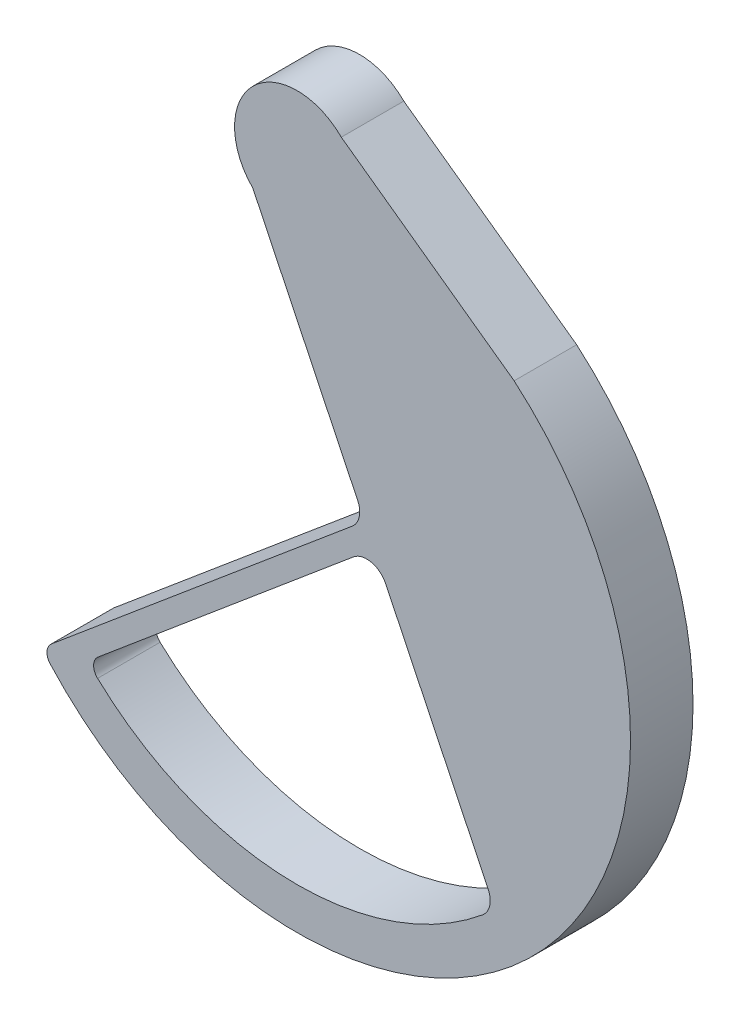
ISO-10303-21;
HEADER;
FILE_DESCRIPTION(('STEP AP214'),'2;1');
FILE_NAME('part.step','',(''),(''),'','','');
FILE_SCHEMA(('AUTOMOTIVE_DESIGN { 1 0 10303 214 1 1 1 1 }'));
ENDSEC;
DATA;
#1=APPLICATION_CONTEXT('core data for automotive mechanical design processes');
#2=APPLICATION_PROTOCOL_DEFINITION('international standard','automotive_design',2000,#1);
#3=PRODUCT_CONTEXT('',#1,'mechanical');
#4=PRODUCT('Part','Part','',(#3));
#5=PRODUCT_RELATED_PRODUCT_CATEGORY('part','',(#4));
#6=PRODUCT_DEFINITION_FORMATION('','',#4);
#7=PRODUCT_DEFINITION_CONTEXT('part definition',#1,'design');
#8=PRODUCT_DEFINITION('design','',#6,#7);
#9=PRODUCT_DEFINITION_SHAPE('','',#8);
#10=(LENGTH_UNIT() NAMED_UNIT(*) SI_UNIT(.MILLI.,.METRE.));
#11=(NAMED_UNIT(*) PLANE_ANGLE_UNIT() SI_UNIT($,.RADIAN.));
#12=(NAMED_UNIT(*) SI_UNIT($,.STERADIAN.) SOLID_ANGLE_UNIT());
#13=UNCERTAINTY_MEASURE_WITH_UNIT(LENGTH_MEASURE(1.E-05),#10,'distance_accuracy_value','');
#14=(GEOMETRIC_REPRESENTATION_CONTEXT(3) GLOBAL_UNCERTAINTY_ASSIGNED_CONTEXT((#13)) GLOBAL_UNIT_ASSIGNED_CONTEXT((#10,
#11,#12)) REPRESENTATION_CONTEXT('',''));
#15=CARTESIAN_POINT('',(0.,0.,0.));
#16=DIRECTION('',(0.,0.,1.));
#17=DIRECTION('',(1.,0.,0.));
#18=AXIS2_PLACEMENT_3D('',#15,#16,#17);
#19=CARTESIAN_POINT('',(-12.7570586950624,-6.1348621133076,15.));
#20=DIRECTION('',(0.901206602628173,0.433389731511241,0.));
#21=DIRECTION('',(-0.433389731511241,0.901206602628173,0.));
#22=AXIS2_PLACEMENT_3D('',#19,#20,#21);
#23=PLANE('',#22);
#24=DIRECTION('',(0.433389731511241,-0.901206602628173,0.));
#25=VECTOR('',#24,1.);
#26=CARTESIAN_POINT('',(-12.7570586950624,-6.1348621133076,0.));
#27=LINE('',#26,#25);
#28=CARTESIAN_POINT('',(21.2324006956412,-76.8137984043253,0.));
#29=VERTEX_POINT('',#28);
#30=CARTESIAN_POINT('',(45.844843506453,-127.9938203457,0.));
#31=VERTEX_POINT('',#30);
#32=EDGE_CURVE('E185',#29,#31,#27,.T.);
#33=ORIENTED_EDGE('',*,*,#32,.T.);
#34=DIRECTION('',(0.,0.,-1.));
#35=VECTOR('',#34,1.);
#36=CARTESIAN_POINT('',(45.844843506453,-127.9938203457,15.));
#37=LINE('',#36,#35);
#38=CARTESIAN_POINT('',(45.844843506453,-127.9938203457,15.));
#39=VERTEX_POINT('',#38);
#40=EDGE_CURVE('E11',#39,#31,#37,.T.);
#41=ORIENTED_EDGE('',*,*,#40,.F.);
#42=DIRECTION('',(0.433389731511241,-0.901206602628173,0.));
#43=VECTOR('',#42,1.);
#44=CARTESIAN_POINT('',(-12.7570586950624,-6.1348621133076,15.));
#45=LINE('',#44,#43);
#46=CARTESIAN_POINT('',(21.2324006956412,-76.8137984043253,15.));
#47=VERTEX_POINT('',#46);
#48=EDGE_CURVE('E250',#47,#39,#45,.T.);
#49=ORIENTED_EDGE('',*,*,#48,.F.);
#50=DIRECTION('',(0.,0.,-1.));
#51=VECTOR('',#50,1.);
#52=CARTESIAN_POINT('',(21.2324006956412,-76.8137984043253,15.));
#53=LINE('',#52,#51);
#54=EDGE_CURVE('E198',#47,#29,#53,.T.);
#55=ORIENTED_EDGE('',*,*,#54,.T.);
#56=EDGE_LOOP('',(#33,#41,#49,#55));
#57=FACE_BOUND('',#56,.T.);
#58=ADVANCED_FACE('F35',(#57),#23,.F.);
#59=CARTESIAN_POINT('',(41.3388104933121,-130.160769003256,15.));
#60=DIRECTION('',(0.,0.,-1.));
#61=DIRECTION('',(-1.,0.,0.));
#62=AXIS2_PLACEMENT_3D('',#59,#60,#61);
#63=CYLINDRICAL_SURFACE('',#62,4.99999999999999);
#64=CARTESIAN_POINT('',(41.3388104933121,-130.160769003256,0.));
#65=DIRECTION('',(0.,0.,1.));
#66=DIRECTION('',(1.,0.,0.));
#67=AXIS2_PLACEMENT_3D('',#64,#65,#66);
#68=CIRCLE('',#67,4.99999999999999);
#69=CARTESIAN_POINT('',(44.5187189927976,-134.019289695814,0.));
#70=VERTEX_POINT('',#69);
#71=EDGE_CURVE('E188',#31,#70,#68,.F.);
#72=ORIENTED_EDGE('',*,*,#71,.T.);
#73=DIRECTION('',(0.,0.,-1.));
#74=VECTOR('',#73,1.);
#75=CARTESIAN_POINT('',(44.5187189927976,-134.019289695814,15.));
#76=LINE('',#75,#74);
#77=CARTESIAN_POINT('',(44.5187189927976,-134.019289695814,15.));
#78=VERTEX_POINT('',#77);
#79=EDGE_CURVE('E45',#78,#70,#76,.T.);
#80=ORIENTED_EDGE('',*,*,#79,.F.);
#81=CARTESIAN_POINT('',(41.3388104933121,-130.160769003256,15.));
#82=DIRECTION('',(0.,0.,1.));
#83=DIRECTION('',(1.,0.,0.));
#84=AXIS2_PLACEMENT_3D('',#81,#82,#83);
#85=CIRCLE('',#84,4.99999999999999);
#86=EDGE_CURVE('E252',#39,#78,#85,.F.);
#87=ORIENTED_EDGE('',*,*,#86,.F.);
#88=ORIENTED_EDGE('',*,*,#40,.T.);
#89=EDGE_LOOP('',(#72,#80,#87,#88));
#90=FACE_BOUND('',#89,.T.);
#91=ADVANCED_FACE('F276',(#90),#63,.F.);
#92=CARTESIAN_POINT('',(0.,-80.,15.));
#93=DIRECTION('',(0.,0.,-1.));
#94=DIRECTION('',(-1.,0.,0.));
#95=AXIS2_PLACEMENT_3D('',#92,#93,#94);
#96=CYLINDRICAL_SURFACE('',#95,70.);
#97=CARTESIAN_POINT('',(0.,-80.,0.));
#98=DIRECTION('',(0.,0.,1.));
#99=DIRECTION('',(1.,0.,0.));
#100=AXIS2_PLACEMENT_3D('',#97,#98,#99);
#101=CIRCLE('',#100,70.);
#102=CARTESIAN_POINT('',(-47.870174388264,-131.072951785042,0.));
#103=VERTEX_POINT('',#102);
#104=EDGE_CURVE('E191',#103,#70,#101,.T.);
#105=ORIENTED_EDGE('',*,*,#104,.F.);
#106=DIRECTION('',(0.,0.,-1.));
#107=VECTOR('',#106,1.);
#108=CARTESIAN_POINT('',(-47.870174388264,-131.072951785042,15.));
#109=LINE('',#108,#107);
#110=CARTESIAN_POINT('',(-47.870174388264,-131.072951785042,15.));
#111=VERTEX_POINT('',#110);
#112=EDGE_CURVE('E155',#111,#103,#109,.T.);
#113=ORIENTED_EDGE('',*,*,#112,.F.);
#114=CARTESIAN_POINT('',(0.,-80.,15.));
#115=DIRECTION('',(0.,0.,1.));
#116=DIRECTION('',(1.,0.,0.));
#117=AXIS2_PLACEMENT_3D('',#114,#115,#116);
#118=CIRCLE('',#117,70.);
#119=EDGE_CURVE('E148',#111,#78,#118,.T.);
#120=ORIENTED_EDGE('',*,*,#119,.T.);
#121=ORIENTED_EDGE('',*,*,#79,.T.);
#122=EDGE_LOOP('',(#105,#113,#120,#121));
#123=FACE_BOUND('',#122,.T.);
#124=ADVANCED_FACE('F255',(#123),#96,.F.);
#125=CARTESIAN_POINT('',(-45.8185954859101,-128.884110994254,15.));
#126=DIRECTION('',(0.,0.,-1.));
#127=DIRECTION('',(-1.,0.,0.));
#128=AXIS2_PLACEMENT_3D('',#125,#126,#127);
#129=CYLINDRICAL_SURFACE('',#128,2.99999999999979);
#130=CARTESIAN_POINT('',(-45.8185954859101,-128.884110994254,0.));
#131=DIRECTION('',(0.,0.,1.));
#132=DIRECTION('',(1.,0.,0.));
#133=AXIS2_PLACEMENT_3D('',#130,#131,#132);
#134=CIRCLE('',#133,2.99999999999979);
#135=CARTESIAN_POINT('',(-47.7476784165524,-126.586582094174,0.));
#136=VERTEX_POINT('',#135);
#137=EDGE_CURVE('E154',#103,#136,#134,.F.);
#138=ORIENTED_EDGE('',*,*,#137,.T.);
#139=DIRECTION('',(0.,0.,-1.));
#140=VECTOR('',#139,1.);
#141=CARTESIAN_POINT('',(-47.7476784165524,-126.586582094174,15.));
#142=LINE('',#141,#140);
#143=CARTESIAN_POINT('',(-47.7476784165524,-126.586582094174,15.));
#144=VERTEX_POINT('',#143);
#145=EDGE_CURVE('E151',#144,#136,#142,.T.);
#146=ORIENTED_EDGE('',*,*,#145,.F.);
#147=CARTESIAN_POINT('',(-45.8185954859101,-128.884110994254,15.));
#148=DIRECTION('',(0.,0.,1.));
#149=DIRECTION('',(1.,0.,0.));
#150=AXIS2_PLACEMENT_3D('',#147,#148,#149);
#151=CIRCLE('',#150,2.99999999999979);
#152=EDGE_CURVE('E142',#111,#144,#151,.F.);
#153=ORIENTED_EDGE('',*,*,#152,.F.);
#154=ORIENTED_EDGE('',*,*,#112,.T.);
#155=EDGE_LOOP('',(#138,#146,#153,#154));
#156=FACE_BOUND('',#155,.T.);
#157=ADVANCED_FACE('F152',(#156),#129,.F.);
#158=CARTESIAN_POINT('',(42.5956727933285,-50.7312504333006,15.));
#159=DIRECTION('',(-0.643027643547508,0.765842966693394,0.));
#160=DIRECTION('',(-0.765842966693394,-0.643027643547508,0.));
#161=AXIS2_PLACEMENT_3D('',#158,#159,#160);
#162=PLANE('',#161);
#163=DIRECTION('',(0.765842966693394,0.643027643547508,0.));
#164=VECTOR('',#163,1.);
#165=CARTESIAN_POINT('',(42.5956727933285,-50.7312504333006,0.));
#166=LINE('',#165,#164);
#167=CARTESIAN_POINT('',(13.5112294647628,-75.1515322284145,0.));
#168=VERTEX_POINT('',#167);
#169=EDGE_CURVE('E98',#136,#168,#166,.T.);
#170=ORIENTED_EDGE('',*,*,#169,.T.);
#171=DIRECTION('',(0.,0.,-1.));
#172=VECTOR('',#171,1.);
#173=CARTESIAN_POINT('',(13.5112294647628,-75.1515322284145,15.));
#174=LINE('',#173,#172);
#175=CARTESIAN_POINT('',(13.5112294647628,-75.1515322284145,15.));
#176=VERTEX_POINT('',#175);
#177=EDGE_CURVE('E156',#176,#168,#174,.T.);
#178=ORIENTED_EDGE('',*,*,#177,.F.);
#179=DIRECTION('',(0.765842966693394,0.643027643547508,0.));
#180=VECTOR('',#179,1.);
#181=CARTESIAN_POINT('',(42.5956727933285,-50.7312504333006,15.));
#182=LINE('',#181,#180);
#183=EDGE_CURVE('E146',#144,#176,#182,.T.);
#184=ORIENTED_EDGE('',*,*,#183,.F.);
#185=ORIENTED_EDGE('',*,*,#145,.T.);
#186=EDGE_LOOP('',(#170,#178,#184,#185));
#187=FACE_BOUND('',#186,.T.);
#188=ADVANCED_FACE('F158',(#187),#162,.F.);
#189=CARTESIAN_POINT('',(10.0302471408598,-65.0565868768263,15.));
#190=DIRECTION('',(0.,0.,-1.));
#191=DIRECTION('',(-1.,0.,0.));
#192=AXIS2_PLACEMENT_3D('',#189,#190,#191);
#193=CYLINDRICAL_SURFACE('',#192,5.);
#194=CARTESIAN_POINT('',(10.0302471408598,-65.0565868768263,0.));
#195=DIRECTION('',(0.,0.,1.));
#196=DIRECTION('',(1.,0.,0.));
#197=AXIS2_PLACEMENT_3D('',#194,#195,#196);
#198=CIRCLE('',#197,5.);
#199=CARTESIAN_POINT('',(13.2441851892925,-68.8868090924212,0.));
#200=VERTEX_POINT('',#199);
#201=CARTESIAN_POINT('',(14.5362801540007,-62.8896382192701,0.));
#202=VERTEX_POINT('',#201);
#203=EDGE_CURVE('E164',#200,#202,#198,.T.);
#204=ORIENTED_EDGE('',*,*,#203,.F.);
#205=DIRECTION('',(0.,0.,-1.));
#206=VECTOR('',#205,1.);
#207=CARTESIAN_POINT('',(13.2441851892925,-68.8868090924212,15.));
#208=LINE('',#207,#206);
#209=CARTESIAN_POINT('',(13.2441851892925,-68.8868090924212,15.));
#210=VERTEX_POINT('',#209);
#211=EDGE_CURVE('E39',#210,#200,#208,.T.);
#212=ORIENTED_EDGE('',*,*,#211,.F.);
#213=CARTESIAN_POINT('',(10.0302471408598,-65.0565868768263,15.));
#214=DIRECTION('',(0.,0.,1.));
#215=DIRECTION('',(1.,0.,0.));
#216=AXIS2_PLACEMENT_3D('',#213,#214,#215);
#217=CIRCLE('',#216,5.);
#218=CARTESIAN_POINT('',(14.5362801540007,-62.8896382192701,15.));
#219=VERTEX_POINT('',#218);
#220=EDGE_CURVE('E197',#210,#219,#217,.T.);
#221=ORIENTED_EDGE('',*,*,#220,.T.);
#222=DIRECTION('',(0.,0.,-1.));
#223=VECTOR('',#222,1.);
#224=CARTESIAN_POINT('',(14.5362801540007,-62.8896382192701,15.));
#225=LINE('',#224,#223);
#226=EDGE_CURVE('E160',#219,#202,#225,.T.);
#227=ORIENTED_EDGE('',*,*,#226,.T.);
#228=EDGE_LOOP('',(#204,#212,#221,#227));
#229=FACE_BOUND('',#228,.T.);
#230=ADVANCED_FACE('F37',(#229),#193,.F.);
#231=CARTESIAN_POINT('',(39.3923101204882,-46.9459271066778,15.));
#232=DIRECTION('',(-0.642787609686534,0.766044443118983,0.));
#233=DIRECTION('',(-0.766044443118982,-0.642787609686534,0.));
#234=AXIS2_PLACEMENT_3D('',#231,#232,#233);
#235=PLANE('',#234);
#236=DIRECTION('',(0.766044443118982,0.642787609686534,0.));
#237=VECTOR('',#236,1.);
#238=CARTESIAN_POINT('',(39.3923101204882,-46.9459271066778,0.));
#239=LINE('',#238,#237);
#240=CARTESIAN_POINT('',(-58.9406362868111,-129.457066169617,0.));
#241=VERTEX_POINT('',#240);
#242=EDGE_CURVE('E167',#241,#200,#239,.T.);
#243=ORIENTED_EDGE('',*,*,#242,.F.);
#244=DIRECTION('',(0.,0.,-1.));
#245=VECTOR('',#244,1.);
#246=CARTESIAN_POINT('',(-58.9406362868111,-129.457066169617,15.));
#247=LINE('',#246,#245);
#248=CARTESIAN_POINT('',(-58.9406362868111,-129.457066169617,15.));
#249=VERTEX_POINT('',#248);
#250=EDGE_CURVE('E212',#249,#241,#247,.T.);
#251=ORIENTED_EDGE('',*,*,#250,.F.);
#252=DIRECTION('',(0.766044443118982,0.642787609686534,0.));
#253=VECTOR('',#252,1.);
#254=CARTESIAN_POINT('',(39.3923101204882,-46.9459271066778,15.));
#255=LINE('',#254,#253);
#256=EDGE_CURVE('E221',#249,#210,#255,.T.);
#257=ORIENTED_EDGE('',*,*,#256,.T.);
#258=ORIENTED_EDGE('',*,*,#211,.T.);
#259=EDGE_LOOP('',(#243,#251,#257,#258));
#260=FACE_BOUND('',#259,.T.);
#261=ADVANCED_FACE('F219',(#260),#235,.T.);
#262=CARTESIAN_POINT('',(-57.0122734577518,-131.755199498973,15.));
#263=DIRECTION('',(0.,0.,-1.));
#264=DIRECTION('',(-1.,0.,0.));
#265=AXIS2_PLACEMENT_3D('',#262,#263,#264);
#266=CYLINDRICAL_SURFACE('',#265,2.99999999999976);
#267=CARTESIAN_POINT('',(-57.0122734577518,-131.755199498973,0.));
#268=DIRECTION('',(0.,0.,1.));
#269=DIRECTION('',(1.,0.,0.));
#270=AXIS2_PLACEMENT_3D('',#267,#268,#269);
#271=CIRCLE('',#270,2.99999999999976);
#272=CARTESIAN_POINT('',(-59.2335308651964,-133.771635843089,0.));
#273=VERTEX_POINT('',#272);
#274=EDGE_CURVE('E171',#273,#241,#271,.F.);
#275=ORIENTED_EDGE('',*,*,#274,.F.);
#276=DIRECTION('',(0.,0.,-1.));
#277=VECTOR('',#276,1.);
#278=CARTESIAN_POINT('',(-59.2335308651964,-133.771635843089,15.));
#279=LINE('',#278,#277);
#280=CARTESIAN_POINT('',(-59.2335308651964,-133.771635843089,15.));
#281=VERTEX_POINT('',#280);
#282=EDGE_CURVE('E211',#281,#273,#279,.T.);
#283=ORIENTED_EDGE('',*,*,#282,.F.);
#284=CARTESIAN_POINT('',(-57.0122734577518,-131.755199498973,15.));
#285=DIRECTION('',(0.,0.,1.));
#286=DIRECTION('',(1.,0.,0.));
#287=AXIS2_PLACEMENT_3D('',#284,#285,#286);
#288=CIRCLE('',#287,2.99999999999976);
#289=EDGE_CURVE('E231',#281,#249,#288,.F.);
#290=ORIENTED_EDGE('',*,*,#289,.T.);
#291=ORIENTED_EDGE('',*,*,#250,.T.);
#292=EDGE_LOOP('',(#275,#283,#290,#291));
#293=FACE_BOUND('',#292,.T.);
#294=ADVANCED_FACE('F228',(#293),#266,.T.);
#295=CARTESIAN_POINT('',(0.,-80.,15.));
#296=DIRECTION('',(0.,0.,-1.));
#297=DIRECTION('',(-1.,0.,0.));
#298=AXIS2_PLACEMENT_3D('',#295,#296,#297);
#299=CYLINDRICAL_SURFACE('',#298,80.);
#300=CARTESIAN_POINT('',(0.,-80.,0.));
#301=DIRECTION('',(0.,0.,1.));
#302=DIRECTION('',(1.,0.,0.));
#303=AXIS2_PLACEMENT_3D('',#300,#301,#302);
#304=CIRCLE('',#303,80.);
#305=CARTESIAN_POINT('',(52.0761789176771,-19.2705047828151,0.));
#306=VERTEX_POINT('',#305);
#307=EDGE_CURVE('E174',#273,#306,#304,.T.);
#308=ORIENTED_EDGE('',*,*,#307,.T.);
#309=DIRECTION('',(0.,0.,-1.));
#310=VECTOR('',#309,1.);
#311=CARTESIAN_POINT('',(52.0761789176771,-19.2705047828151,15.));
#312=LINE('',#311,#310);
#313=CARTESIAN_POINT('',(52.0761789176771,-19.2705047828151,15.));
#314=VERTEX_POINT('',#313);
#315=EDGE_CURVE('E209',#314,#306,#312,.T.);
#316=ORIENTED_EDGE('',*,*,#315,.F.);
#317=CARTESIAN_POINT('',(0.,-80.,15.));
#318=DIRECTION('',(0.,0.,1.));
#319=DIRECTION('',(1.,0.,0.));
#320=AXIS2_PLACEMENT_3D('',#317,#318,#319);
#321=CIRCLE('',#320,80.);
#322=EDGE_CURVE('E234',#281,#314,#321,.T.);
#323=ORIENTED_EDGE('',*,*,#322,.F.);
#324=ORIENTED_EDGE('',*,*,#282,.T.);
#325=EDGE_LOOP('',(#308,#316,#323,#324));
#326=FACE_BOUND('',#325,.T.);
#327=ADVANCED_FACE('F235',(#326),#299,.T.);
#328=CARTESIAN_POINT('',(8.65474635415258,12.0128323695447,15.));
#329=DIRECTION('',(0.584549661802916,0.811357931424902,0.));
#330=DIRECTION('',(-0.811357931424902,0.584549661802916,0.));
#331=AXIS2_PLACEMENT_3D('',#328,#329,#330);
#332=PLANE('',#331);
#333=DIRECTION('',(0.811357931424902,-0.584549661802916,0.));
#334=VECTOR('',#333,1.);
#335=CARTESIAN_POINT('',(8.65474635415258,12.0128323695447,0.));
#336=LINE('',#335,#334);
#337=CARTESIAN_POINT('',(10.6066017177981,10.6066017177983,0.));
#338=VERTEX_POINT('',#337);
#339=EDGE_CURVE('E177',#338,#306,#336,.T.);
#340=ORIENTED_EDGE('',*,*,#339,.F.);
#341=DIRECTION('',(0.,0.,-1.));
#342=VECTOR('',#341,1.);
#343=CARTESIAN_POINT('',(10.6066017177981,10.6066017177983,15.));
#344=LINE('',#343,#342);
#345=CARTESIAN_POINT('',(10.6066017177981,10.6066017177983,15.));
#346=VERTEX_POINT('',#345);
#347=EDGE_CURVE('E207',#346,#338,#344,.T.);
#348=ORIENTED_EDGE('',*,*,#347,.F.);
#349=DIRECTION('',(0.811357931424902,-0.584549661802916,0.));
#350=VECTOR('',#349,1.);
#351=CARTESIAN_POINT('',(8.65474635415258,12.0128323695447,15.));
#352=LINE('',#351,#350);
#353=EDGE_CURVE('E239',#346,#314,#352,.T.);
#354=ORIENTED_EDGE('',*,*,#353,.T.);
#355=ORIENTED_EDGE('',*,*,#315,.T.);
#356=EDGE_LOOP('',(#340,#348,#354,#355));
#357=FACE_BOUND('',#356,.T.);
#358=ADVANCED_FACE('F287',(#357),#332,.T.);
#359=CARTESIAN_POINT('',(0.,0.,15.));
#360=DIRECTION('',(0.,0.,-1.));
#361=DIRECTION('',(-1.,0.,0.));
#362=AXIS2_PLACEMENT_3D('',#359,#360,#361);
#363=CYLINDRICAL_SURFACE('',#362,15.);
#364=CARTESIAN_POINT('',(0.,0.,0.));
#365=DIRECTION('',(0.,0.,1.));
#366=DIRECTION('',(1.,0.,0.));
#367=AXIS2_PLACEMENT_3D('',#364,#365,#366);
#368=CIRCLE('',#367,15.);
#369=CARTESIAN_POINT('',(-10.6066017177981,-10.6066017177983,0.));
#370=VERTEX_POINT('',#369);
#371=EDGE_CURVE('E180',#338,#370,#368,.T.);
#372=ORIENTED_EDGE('',*,*,#371,.T.);
#373=DIRECTION('',(0.,0.,-1.));
#374=VECTOR('',#373,1.);
#375=CARTESIAN_POINT('',(-10.6066017177981,-10.6066017177983,15.));
#376=LINE('',#375,#374);
#377=CARTESIAN_POINT('',(-10.6066017177981,-10.6066017177983,15.));
#378=VERTEX_POINT('',#377);
#379=EDGE_CURVE('E204',#378,#370,#376,.T.);
#380=ORIENTED_EDGE('',*,*,#379,.F.);
#381=CARTESIAN_POINT('',(0.,0.,15.));
#382=DIRECTION('',(0.,0.,1.));
#383=DIRECTION('',(1.,0.,0.));
#384=AXIS2_PLACEMENT_3D('',#381,#382,#383);
#385=CIRCLE('',#384,15.);
#386=EDGE_CURVE('E246',#346,#378,#385,.T.);
#387=ORIENTED_EDGE('',*,*,#386,.F.);
#388=ORIENTED_EDGE('',*,*,#347,.T.);
#389=EDGE_LOOP('',(#372,#380,#387,#388));
#390=FACE_BOUND('',#389,.T.);
#391=ADVANCED_FACE('F270',(#390),#363,.T.);
#392=CARTESIAN_POINT('',(-12.7570586950624,-6.13486211330761,15.));
#393=DIRECTION('',(0.901206602628173,0.433389731511242,0.));
#394=DIRECTION('',(-0.433389731511242,0.901206602628173,0.));
#395=AXIS2_PLACEMENT_3D('',#392,#393,#394);
#396=PLANE('',#395);
#397=DIRECTION('',(0.433389731511242,-0.901206602628173,0.));
#398=VECTOR('',#397,1.);
#399=CARTESIAN_POINT('',(-12.7570586950624,-6.13486211330761,0.));
#400=LINE('',#399,#398);
#401=EDGE_CURVE('E182',#370,#202,#400,.T.);
#402=ORIENTED_EDGE('',*,*,#401,.T.);
#403=ORIENTED_EDGE('',*,*,#226,.F.);
#404=DIRECTION('',(0.433389731511242,-0.901206602628173,0.));
#405=VECTOR('',#404,1.);
#406=CARTESIAN_POINT('',(-12.7570586950624,-6.13486211330761,15.));
#407=LINE('',#406,#405);
#408=EDGE_CURVE('E248',#378,#219,#407,.T.);
#409=ORIENTED_EDGE('',*,*,#408,.F.);
#410=ORIENTED_EDGE('',*,*,#379,.T.);
#411=EDGE_LOOP('',(#402,#403,#409,#410));
#412=FACE_BOUND('',#411,.T.);
#413=ADVANCED_FACE('F263',(#412),#396,.F.);
#414=CARTESIAN_POINT('',(16.7263676825004,-78.9807470618814,15.));
#415=DIRECTION('',(0.,0.,-1.));
#416=DIRECTION('',(-1.,0.,0.));
#417=AXIS2_PLACEMENT_3D('',#414,#415,#416);
#418=CYLINDRICAL_SURFACE('',#417,5.);
#419=CARTESIAN_POINT('',(16.7263676825004,-78.9807470618814,0.));
#420=DIRECTION('',(0.,0.,1.));
#421=DIRECTION('',(1.,0.,0.));
#422=AXIS2_PLACEMENT_3D('',#419,#420,#421);
#423=CIRCLE('',#422,5.);
#424=EDGE_CURVE('E104',#168,#29,#423,.F.);
#425=ORIENTED_EDGE('',*,*,#424,.T.);
#426=ORIENTED_EDGE('',*,*,#54,.F.);
#427=CARTESIAN_POINT('',(16.7263676825004,-78.9807470618814,15.));
#428=DIRECTION('',(0.,0.,1.));
#429=DIRECTION('',(1.,0.,0.));
#430=AXIS2_PLACEMENT_3D('',#427,#428,#429);
#431=CIRCLE('',#430,5.);
#432=EDGE_CURVE('E54',#176,#47,#431,.F.);
#433=ORIENTED_EDGE('',*,*,#432,.F.);
#434=ORIENTED_EDGE('',*,*,#177,.T.);
#435=EDGE_LOOP('',(#425,#426,#433,#434));
#436=FACE_BOUND('',#435,.T.);
#437=ADVANCED_FACE('F261',(#436),#418,.F.);
#438=CARTESIAN_POINT('',(0.,0.,15.));
#439=DIRECTION('',(0.,0.,1.));
#440=DIRECTION('',(1.,0.,0.));
#441=AXIS2_PLACEMENT_3D('',#438,#439,#440);
#442=PLANE('',#441);
#443=ORIENTED_EDGE('',*,*,#220,.F.);
#444=ORIENTED_EDGE('',*,*,#256,.F.);
#445=ORIENTED_EDGE('',*,*,#289,.F.);
#446=ORIENTED_EDGE('',*,*,#322,.T.);
#447=ORIENTED_EDGE('',*,*,#353,.F.);
#448=ORIENTED_EDGE('',*,*,#386,.T.);
#449=ORIENTED_EDGE('',*,*,#408,.T.);
#450=EDGE_LOOP('',(#443,#444,#445,#446,#447,#448,#449));
#451=FACE_BOUND('',#450,.T.);
#452=ORIENTED_EDGE('',*,*,#48,.T.);
#453=ORIENTED_EDGE('',*,*,#86,.T.);
#454=ORIENTED_EDGE('',*,*,#119,.F.);
#455=ORIENTED_EDGE('',*,*,#152,.T.);
#456=ORIENTED_EDGE('',*,*,#183,.T.);
#457=ORIENTED_EDGE('',*,*,#432,.T.);
#458=EDGE_LOOP('',(#452,#453,#454,#455,#456,#457));
#459=FACE_BOUND('',#458,.T.);
#460=ADVANCED_FACE('F144',(#451,#459),#442,.T.);
#461=CARTESIAN_POINT('',(0.,0.,0.));
#462=DIRECTION('',(0.,0.,1.));
#463=DIRECTION('',(1.,0.,0.));
#464=AXIS2_PLACEMENT_3D('',#461,#462,#463);
#465=PLANE('',#464);
#466=CARTESIAN_POINT('',(0.,0.,0.));
#467=DIRECTION('',(0.,0.,-1.));
#468=DIRECTION('',(-1.,0.,0.));
#469=AXIS2_PLACEMENT_3D('',#466,#467,#468);
#470=CIRCLE('',#469,10.1);
#471=CARTESIAN_POINT('',(-10.1,0.,0.));
#472=VERTEX_POINT('',#471);
#473=EDGE_CURVE('E402',#472,#472,#470,.T.);
#474=ORIENTED_EDGE('',*,*,#473,.F.);
#475=EDGE_LOOP('',(#474));
#476=FACE_BOUND('',#475,.T.);
#477=ORIENTED_EDGE('',*,*,#203,.T.);
#478=ORIENTED_EDGE('',*,*,#401,.F.);
#479=ORIENTED_EDGE('',*,*,#371,.F.);
#480=ORIENTED_EDGE('',*,*,#339,.T.);
#481=ORIENTED_EDGE('',*,*,#307,.F.);
#482=ORIENTED_EDGE('',*,*,#274,.T.);
#483=ORIENTED_EDGE('',*,*,#242,.T.);
#484=EDGE_LOOP('',(#477,#478,#479,#480,#481,#482,#483));
#485=FACE_BOUND('',#484,.T.);
#486=ORIENTED_EDGE('',*,*,#32,.F.);
#487=ORIENTED_EDGE('',*,*,#424,.F.);
#488=ORIENTED_EDGE('',*,*,#169,.F.);
#489=ORIENTED_EDGE('',*,*,#137,.F.);
#490=ORIENTED_EDGE('',*,*,#104,.T.);
#491=ORIENTED_EDGE('',*,*,#71,.F.);
#492=EDGE_LOOP('',(#486,#487,#488,#489,#490,#491));
#493=FACE_BOUND('',#492,.T.);
#494=ADVANCED_FACE('F225',(#476,#485,#493),#465,.F.);
#495=CARTESIAN_POINT('',(0.,0.,2.));
#496=DIRECTION('',(0.,0.,-1.));
#497=DIRECTION('',(-1.,0.,0.));
#498=AXIS2_PLACEMENT_3D('',#495,#496,#497);
#499=CYLINDRICAL_SURFACE('',#498,10.1);
#500=CARTESIAN_POINT('',(0.,0.,2.));
#501=DIRECTION('',(0.,0.,-1.));
#502=DIRECTION('',(-1.,0.,0.));
#503=AXIS2_PLACEMENT_3D('',#500,#501,#502);
#504=CIRCLE('',#503,10.1);
#505=CARTESIAN_POINT('',(-10.1,0.,2.));
#506=VERTEX_POINT('',#505);
#507=EDGE_CURVE('E168',#506,#506,#504,.T.);
#508=ORIENTED_EDGE('',*,*,#507,.F.);
#509=EDGE_LOOP('',(#508));
#510=FACE_BOUND('',#509,.T.);
#511=ORIENTED_EDGE('',*,*,#473,.T.);
#512=EDGE_LOOP('',(#511));
#513=FACE_BOUND('',#512,.T.);
#514=ADVANCED_FACE('F377',(#510,#513),#499,.F.);
#515=CARTESIAN_POINT('',(0.,0.,2.));
#516=DIRECTION('',(0.,0.,-1.));
#517=DIRECTION('',(-1.,0.,0.));
#518=AXIS2_PLACEMENT_3D('',#515,#516,#517);
#519=PLANE('',#518);
#520=ORIENTED_EDGE('',*,*,#507,.T.);
#521=EDGE_LOOP('',(#520));
#522=FACE_BOUND('',#521,.T.);
#523=ADVANCED_FACE('F386',(#522),#519,.T.);
#524=CLOSED_SHELL('',(#58,#91,#124,#157,#188,#230,#261,#294,#327,#358,#391,#413,#437,#460,#494,
#514,#523));
#525=MANIFOLD_SOLID_BREP('B2',#524);
#526=ADVANCED_BREP_SHAPE_REPRESENTATION('',(#18,#525),#14);
#527=SHAPE_DEFINITION_REPRESENTATION(#9,#526);
ENDSEC;
END-ISO-10303-21;
